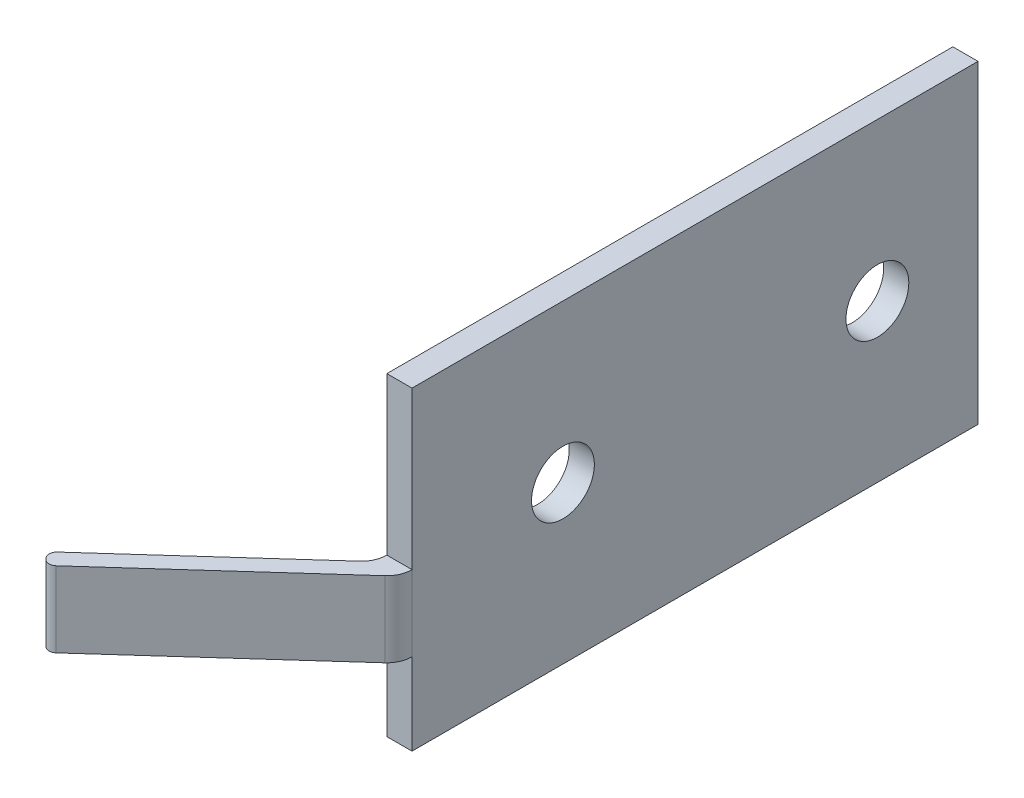
ISO-10303-21;
HEADER;
FILE_DESCRIPTION(('STEP AP214'),'2;1');
FILE_NAME('part.step','',(''),(''),'','','');
FILE_SCHEMA(('AUTOMOTIVE_DESIGN { 1 0 10303 214 1 1 1 1 }'));
ENDSEC;
DATA;
#1=APPLICATION_CONTEXT('core data for automotive mechanical design processes');
#2=APPLICATION_PROTOCOL_DEFINITION('international standard','automotive_design',2000,#1);
#3=PRODUCT_CONTEXT('',#1,'mechanical');
#4=PRODUCT('Part','Part','',(#3));
#5=PRODUCT_RELATED_PRODUCT_CATEGORY('part','',(#4));
#6=PRODUCT_DEFINITION_FORMATION('','',#4);
#7=PRODUCT_DEFINITION_CONTEXT('part definition',#1,'design');
#8=PRODUCT_DEFINITION('design','',#6,#7);
#9=PRODUCT_DEFINITION_SHAPE('','',#8);
#10=(LENGTH_UNIT() NAMED_UNIT(*) SI_UNIT(.MILLI.,.METRE.));
#11=(NAMED_UNIT(*) PLANE_ANGLE_UNIT() SI_UNIT($,.RADIAN.));
#12=(NAMED_UNIT(*) SI_UNIT($,.STERADIAN.) SOLID_ANGLE_UNIT());
#13=UNCERTAINTY_MEASURE_WITH_UNIT(LENGTH_MEASURE(1.E-05),#10,'distance_accuracy_value','');
#14=(GEOMETRIC_REPRESENTATION_CONTEXT(3) GLOBAL_UNCERTAINTY_ASSIGNED_CONTEXT((#13)) GLOBAL_UNIT_ASSIGNED_CONTEXT((#10,
#11,#12)) REPRESENTATION_CONTEXT('',''));
#15=CARTESIAN_POINT('',(0.,0.,0.));
#16=DIRECTION('',(0.,0.,1.));
#17=DIRECTION('',(1.,0.,0.));
#18=AXIS2_PLACEMENT_3D('',#15,#16,#17);
#19=CARTESIAN_POINT('',(-1.,12.5,22.5));
#20=DIRECTION('',(0.,0.,-1.));
#21=DIRECTION('',(-1.,0.,0.));
#22=AXIS2_PLACEMENT_3D('',#19,#20,#21);
#23=PLANE('',#22);
#24=DIRECTION('',(-1.,0.,0.));
#25=VECTOR('',#24,1.);
#26=CARTESIAN_POINT('',(-1.,0.,22.5));
#27=LINE('',#26,#25);
#28=CARTESIAN_POINT('',(1.,0.,22.5));
#29=VERTEX_POINT('',#28);
#30=CARTESIAN_POINT('',(-1.,0.,22.5));
#31=VERTEX_POINT('',#30);
#32=EDGE_CURVE('E206',#29,#31,#27,.T.);
#33=ORIENTED_EDGE('',*,*,#32,.F.);
#34=DIRECTION('',(0.,-1.,0.));
#35=VECTOR('',#34,1.);
#36=CARTESIAN_POINT('',(1.,12.5,22.5));
#37=LINE('',#36,#35);
#38=CARTESIAN_POINT('',(1.,12.5,22.5));
#39=VERTEX_POINT('',#38);
#40=EDGE_CURVE('E291',#39,#29,#37,.T.);
#41=ORIENTED_EDGE('',*,*,#40,.F.);
#42=DIRECTION('',(1.,0.,0.));
#43=VECTOR('',#42,1.);
#44=CARTESIAN_POINT('',(-1.,12.5,22.5));
#45=LINE('',#44,#43);
#46=CARTESIAN_POINT('',(-1.,12.5,22.5));
#47=VERTEX_POINT('',#46);
#48=EDGE_CURVE('E94',#47,#39,#45,.T.);
#49=ORIENTED_EDGE('',*,*,#48,.F.);
#50=DIRECTION('',(0.,-1.,0.));
#51=VECTOR('',#50,1.);
#52=CARTESIAN_POINT('',(-1.,12.5,22.5));
#53=LINE('',#52,#51);
#54=EDGE_CURVE('E11',#47,#31,#53,.T.);
#55=ORIENTED_EDGE('',*,*,#54,.T.);
#56=EDGE_LOOP('',(#33,#41,#49,#55));
#57=FACE_BOUND('',#56,.T.);
#58=ADVANCED_FACE('F39',(#57),#23,.F.);
#59=CARTESIAN_POINT('',(-1.,12.5,-22.5));
#60=DIRECTION('',(1.,0.,0.));
#61=DIRECTION('',(0.,0.,-1.));
#62=AXIS2_PLACEMENT_3D('',#59,#60,#61);
#63=PLANE('',#62);
#64=CARTESIAN_POINT('',(-1.,0.,10.5));
#65=DIRECTION('',(1.,0.,0.));
#66=DIRECTION('',(0.,0.,-1.));
#67=AXIS2_PLACEMENT_3D('',#64,#65,#66);
#68=CIRCLE('',#67,2.5);
#69=CARTESIAN_POINT('',(-1.,0.,8.));
#70=VERTEX_POINT('',#69);
#71=EDGE_CURVE('E211',#70,#70,#68,.T.);
#72=ORIENTED_EDGE('',*,*,#71,.T.);
#73=EDGE_LOOP('',(#72));
#74=FACE_BOUND('',#73,.T.);
#75=CARTESIAN_POINT('',(-1.,0.,-14.5));
#76=DIRECTION('',(1.,0.,0.));
#77=DIRECTION('',(0.,0.,-1.));
#78=AXIS2_PLACEMENT_3D('',#75,#76,#77);
#79=CIRCLE('',#78,2.5);
#80=CARTESIAN_POINT('',(-1.,0.,-17.));
#81=VERTEX_POINT('',#80);
#82=EDGE_CURVE('E297',#81,#81,#79,.T.);
#83=ORIENTED_EDGE('',*,*,#82,.T.);
#84=EDGE_LOOP('',(#83));
#85=FACE_BOUND('',#84,.T.);
#86=DIRECTION('',(0.,0.,1.));
#87=VECTOR('',#86,1.);
#88=CARTESIAN_POINT('',(-1.,-12.5,-22.5));
#89=LINE('',#88,#87);
#90=CARTESIAN_POINT('',(-1.,-12.5,-22.5));
#91=VERTEX_POINT('',#90);
#92=CARTESIAN_POINT('',(-1.,-12.5,22.5));
#93=VERTEX_POINT('',#92);
#94=EDGE_CURVE('E245',#91,#93,#89,.T.);
#95=ORIENTED_EDGE('',*,*,#94,.T.);
#96=CARTESIAN_POINT('',(-1.,-6.,22.5));
#97=VERTEX_POINT('',#96);
#98=EDGE_CURVE('E49',#97,#93,#53,.T.);
#99=ORIENTED_EDGE('',*,*,#98,.F.);
#100=DIRECTION('',(0.,0.,1.));
#101=VECTOR('',#100,1.);
#102=CARTESIAN_POINT('',(-1.,-6.,22.5095426293829));
#103=LINE('',#102,#101);
#104=CARTESIAN_POINT('',(-1.,-6.,22.5095426293829));
#105=VERTEX_POINT('',#104);
#106=EDGE_CURVE('E57',#97,#105,#103,.T.);
#107=ORIENTED_EDGE('',*,*,#106,.T.);
#108=DIRECTION('',(0.,1.,0.));
#109=VECTOR('',#108,1.);
#110=CARTESIAN_POINT('',(-1.,-6.,22.5095426293829));
#111=LINE('',#110,#109);
#112=CARTESIAN_POINT('',(-1.,0.,22.5095426293829));
#113=VERTEX_POINT('',#112);
#114=EDGE_CURVE('E153',#105,#113,#111,.T.);
#115=ORIENTED_EDGE('',*,*,#114,.T.);
#116=DIRECTION('',(0.,0.,1.));
#117=VECTOR('',#116,1.);
#118=CARTESIAN_POINT('',(-1.,0.,22.5095426293829));
#119=LINE('',#118,#117);
#120=EDGE_CURVE('E210',#31,#113,#119,.T.);
#121=ORIENTED_EDGE('',*,*,#120,.F.);
#122=ORIENTED_EDGE('',*,*,#54,.F.);
#123=DIRECTION('',(0.,0.,1.));
#124=VECTOR('',#123,1.);
#125=CARTESIAN_POINT('',(-1.,12.5,-22.5));
#126=LINE('',#125,#124);
#127=CARTESIAN_POINT('',(-1.,12.5,-22.5));
#128=VERTEX_POINT('',#127);
#129=EDGE_CURVE('E263',#128,#47,#126,.T.);
#130=ORIENTED_EDGE('',*,*,#129,.F.);
#131=DIRECTION('',(0.,-1.,0.));
#132=VECTOR('',#131,1.);
#133=CARTESIAN_POINT('',(-1.,12.5,-22.5));
#134=LINE('',#133,#132);
#135=EDGE_CURVE('E273',#128,#91,#134,.T.);
#136=ORIENTED_EDGE('',*,*,#135,.T.);
#137=EDGE_LOOP('',(#95,#99,#107,#115,#121,#122,#130,#136));
#138=FACE_BOUND('',#137,.T.);
#139=ADVANCED_FACE('F41',(#74,#85,#138),#63,.F.);
#140=CARTESIAN_POINT('',(1.,-6.,22.5));
#141=VERTEX_POINT('',#140);
#142=CARTESIAN_POINT('',(1.,-12.5,22.5));
#143=VERTEX_POINT('',#142);
#144=EDGE_CURVE('E290',#141,#143,#37,.T.);
#145=ORIENTED_EDGE('',*,*,#144,.F.);
#146=DIRECTION('',(-1.,0.,0.));
#147=VECTOR('',#146,1.);
#148=CARTESIAN_POINT('',(-1.,-6.,22.5));
#149=LINE('',#148,#147);
#150=EDGE_CURVE('E174',#141,#97,#149,.T.);
#151=ORIENTED_EDGE('',*,*,#150,.T.);
#152=ORIENTED_EDGE('',*,*,#98,.T.);
#153=DIRECTION('',(1.,0.,0.));
#154=VECTOR('',#153,1.);
#155=CARTESIAN_POINT('',(-1.,-12.5,22.5));
#156=LINE('',#155,#154);
#157=EDGE_CURVE('E276',#93,#143,#156,.T.);
#158=ORIENTED_EDGE('',*,*,#157,.T.);
#159=EDGE_LOOP('',(#145,#151,#152,#158));
#160=FACE_BOUND('',#159,.T.);
#161=ADVANCED_FACE('F325',(#160),#23,.F.);
#162=CARTESIAN_POINT('',(1.,12.5,-22.5));
#163=DIRECTION('',(-1.,0.,0.));
#164=DIRECTION('',(0.,0.,1.));
#165=AXIS2_PLACEMENT_3D('',#162,#163,#164);
#166=PLANE('',#165);
#167=CARTESIAN_POINT('',(1.,0.,10.5));
#168=DIRECTION('',(-1.,0.,0.));
#169=DIRECTION('',(0.,0.,1.));
#170=AXIS2_PLACEMENT_3D('',#167,#168,#169);
#171=CIRCLE('',#170,2.5);
#172=CARTESIAN_POINT('',(1.,0.,8.));
#173=VERTEX_POINT('',#172);
#174=EDGE_CURVE('E43',#173,#173,#171,.T.);
#175=ORIENTED_EDGE('',*,*,#174,.T.);
#176=EDGE_LOOP('',(#175));
#177=FACE_BOUND('',#176,.T.);
#178=CARTESIAN_POINT('',(1.,0.,-14.5));
#179=DIRECTION('',(-1.,0.,0.));
#180=DIRECTION('',(0.,0.,1.));
#181=AXIS2_PLACEMENT_3D('',#178,#179,#180);
#182=CIRCLE('',#181,2.5);
#183=CARTESIAN_POINT('',(1.,0.,-17.));
#184=VERTEX_POINT('',#183);
#185=EDGE_CURVE('E294',#184,#184,#182,.T.);
#186=ORIENTED_EDGE('',*,*,#185,.T.);
#187=EDGE_LOOP('',(#186));
#188=FACE_BOUND('',#187,.T.);
#189=DIRECTION('',(0.,0.,-1.));
#190=VECTOR('',#189,1.);
#191=CARTESIAN_POINT('',(1.,-12.5,-22.5));
#192=LINE('',#191,#190);
#193=CARTESIAN_POINT('',(1.,-12.5,-22.5));
#194=VERTEX_POINT('',#193);
#195=EDGE_CURVE('E280',#143,#194,#192,.T.);
#196=ORIENTED_EDGE('',*,*,#195,.T.);
#197=DIRECTION('',(0.,-1.,0.));
#198=VECTOR('',#197,1.);
#199=CARTESIAN_POINT('',(1.,12.5,-22.5));
#200=LINE('',#199,#198);
#201=CARTESIAN_POINT('',(1.,12.5,-22.5));
#202=VERTEX_POINT('',#201);
#203=EDGE_CURVE('E287',#202,#194,#200,.T.);
#204=ORIENTED_EDGE('',*,*,#203,.F.);
#205=DIRECTION('',(0.,0.,-1.));
#206=VECTOR('',#205,1.);
#207=CARTESIAN_POINT('',(1.,12.5,-22.5));
#208=LINE('',#207,#206);
#209=EDGE_CURVE('E268',#39,#202,#208,.T.);
#210=ORIENTED_EDGE('',*,*,#209,.F.);
#211=ORIENTED_EDGE('',*,*,#40,.T.);
#212=DIRECTION('',(0.,0.,-1.));
#213=VECTOR('',#212,1.);
#214=CARTESIAN_POINT('',(1.,0.,22.5));
#215=LINE('',#214,#213);
#216=CARTESIAN_POINT('',(1.,0.,22.5095426293829));
#217=VERTEX_POINT('',#216);
#218=EDGE_CURVE('E177',#217,#29,#215,.T.);
#219=ORIENTED_EDGE('',*,*,#218,.F.);
#220=DIRECTION('',(0.,1.,0.));
#221=VECTOR('',#220,1.);
#222=CARTESIAN_POINT('',(1.,-6.,22.5095426293829));
#223=LINE('',#222,#221);
#224=CARTESIAN_POINT('',(1.,-6.,22.5095426293829));
#225=VERTEX_POINT('',#224);
#226=EDGE_CURVE('E242',#225,#217,#223,.T.);
#227=ORIENTED_EDGE('',*,*,#226,.F.);
#228=DIRECTION('',(0.,0.,-1.));
#229=VECTOR('',#228,1.);
#230=CARTESIAN_POINT('',(1.,-6.,22.5));
#231=LINE('',#230,#229);
#232=EDGE_CURVE('E162',#225,#141,#231,.T.);
#233=ORIENTED_EDGE('',*,*,#232,.T.);
#234=ORIENTED_EDGE('',*,*,#144,.T.);
#235=EDGE_LOOP('',(#196,#204,#210,#211,#219,#227,#233,#234));
#236=FACE_BOUND('',#235,.T.);
#237=ADVANCED_FACE('F332',(#177,#188,#236),#166,.F.);
#238=CARTESIAN_POINT('',(-1.,12.5,-22.5));
#239=DIRECTION('',(0.,0.,1.));
#240=DIRECTION('',(1.,0.,0.));
#241=AXIS2_PLACEMENT_3D('',#238,#239,#240);
#242=PLANE('',#241);
#243=DIRECTION('',(-1.,0.,0.));
#244=VECTOR('',#243,1.);
#245=CARTESIAN_POINT('',(-1.,-12.5,-22.5));
#246=LINE('',#245,#244);
#247=EDGE_CURVE('E87',#194,#91,#246,.T.);
#248=ORIENTED_EDGE('',*,*,#247,.T.);
#249=ORIENTED_EDGE('',*,*,#135,.F.);
#250=DIRECTION('',(-1.,0.,0.));
#251=VECTOR('',#250,1.);
#252=CARTESIAN_POINT('',(-1.,12.5,-22.5));
#253=LINE('',#252,#251);
#254=EDGE_CURVE('E66',#202,#128,#253,.T.);
#255=ORIENTED_EDGE('',*,*,#254,.F.);
#256=ORIENTED_EDGE('',*,*,#203,.T.);
#257=EDGE_LOOP('',(#248,#249,#255,#256));
#258=FACE_BOUND('',#257,.T.);
#259=ADVANCED_FACE('F337',(#258),#242,.F.);
#260=CARTESIAN_POINT('',(0.,12.5,0.));
#261=DIRECTION('',(0.,1.,0.));
#262=DIRECTION('',(0.,0.,1.));
#263=AXIS2_PLACEMENT_3D('',#260,#261,#262);
#264=PLANE('',#263);
#265=ORIENTED_EDGE('',*,*,#129,.T.);
#266=ORIENTED_EDGE('',*,*,#48,.T.);
#267=ORIENTED_EDGE('',*,*,#209,.T.);
#268=ORIENTED_EDGE('',*,*,#254,.T.);
#269=EDGE_LOOP('',(#265,#266,#267,#268));
#270=FACE_BOUND('',#269,.T.);
#271=ADVANCED_FACE('F353',(#270),#264,.T.);
#272=CARTESIAN_POINT('',(0.,-12.5,0.));
#273=DIRECTION('',(0.,1.,0.));
#274=DIRECTION('',(0.,0.,1.));
#275=AXIS2_PLACEMENT_3D('',#272,#273,#274);
#276=PLANE('',#275);
#277=ORIENTED_EDGE('',*,*,#94,.F.);
#278=ORIENTED_EDGE('',*,*,#247,.F.);
#279=ORIENTED_EDGE('',*,*,#195,.F.);
#280=ORIENTED_EDGE('',*,*,#157,.F.);
#281=EDGE_LOOP('',(#277,#278,#279,#280));
#282=FACE_BOUND('',#281,.T.);
#283=ADVANCED_FACE('F347',(#282),#276,.F.);
#284=CARTESIAN_POINT('',(-1.,-6.,22.5095426293829));
#285=DIRECTION('',(0.,1.,0.));
#286=DIRECTION('',(0.,0.,1.));
#287=AXIS2_PLACEMENT_3D('',#284,#285,#286);
#288=CYLINDRICAL_SURFACE('',#287,2.);
#289=CARTESIAN_POINT('',(-1.,0.,22.5095426293829));
#290=DIRECTION('',(0.,1.,0.));
#291=DIRECTION('',(0.,0.,-1.));
#292=AXIS2_PLACEMENT_3D('',#289,#290,#291);
#293=CIRCLE('',#292,2.);
#294=CARTESIAN_POINT('',(0.338261212717725,0.,23.9958322803377));
#295=VERTEX_POINT('',#294);
#296=EDGE_CURVE('E236',#295,#217,#293,.T.);
#297=ORIENTED_EDGE('',*,*,#296,.F.);
#298=DIRECTION('',(0.,1.,0.));
#299=VECTOR('',#298,1.);
#300=CARTESIAN_POINT('',(0.338261212717725,-6.,23.9958322803377));
#301=LINE('',#300,#299);
#302=CARTESIAN_POINT('',(0.338261212717725,-6.,23.9958322803377));
#303=VERTEX_POINT('',#302);
#304=EDGE_CURVE('E246',#303,#295,#301,.T.);
#305=ORIENTED_EDGE('',*,*,#304,.F.);
#306=CARTESIAN_POINT('',(-1.,-6.,22.5095426293829));
#307=DIRECTION('',(0.,1.,0.));
#308=DIRECTION('',(0.,0.,-1.));
#309=AXIS2_PLACEMENT_3D('',#306,#307,#308);
#310=CIRCLE('',#309,2.);
#311=EDGE_CURVE('E199',#303,#225,#310,.T.);
#312=ORIENTED_EDGE('',*,*,#311,.T.);
#313=ORIENTED_EDGE('',*,*,#226,.T.);
#314=EDGE_LOOP('',(#297,#305,#312,#313));
#315=FACE_BOUND('',#314,.T.);
#316=ADVANCED_FACE('F359',(#315),#288,.T.);
#317=CARTESIAN_POINT('',(0.338261212717725,-6.,23.9958322803377));
#318=DIRECTION('',(0.669130606358861,0.,0.743144825477392));
#319=DIRECTION('',(0.743144825477392,0.,-0.669130606358861));
#320=AXIS2_PLACEMENT_3D('',#317,#318,#319);
#321=PLANE('',#320);
#322=DIRECTION('',(0.743144825477392,0.,-0.669130606358861));
#323=VECTOR('',#322,1.);
#324=CARTESIAN_POINT('',(0.338261212717725,0.,23.9958322803377));
#325=LINE('',#324,#323);
#326=CARTESIAN_POINT('',(-13.4170096142614,0.,36.3811337633619));
#327=VERTEX_POINT('',#326);
#328=EDGE_CURVE('E232',#327,#295,#325,.T.);
#329=ORIENTED_EDGE('',*,*,#328,.F.);
#330=DIRECTION('',(0.,1.,0.));
#331=VECTOR('',#330,1.);
#332=CARTESIAN_POINT('',(-13.4170096142614,-6.,36.3811337633619));
#333=LINE('',#332,#331);
#334=CARTESIAN_POINT('',(-13.4170096142614,-6.,36.3811337633619));
#335=VERTEX_POINT('',#334);
#336=EDGE_CURVE('E249',#335,#327,#333,.T.);
#337=ORIENTED_EDGE('',*,*,#336,.F.);
#338=DIRECTION('',(0.743144825477392,0.,-0.669130606358861));
#339=VECTOR('',#338,1.);
#340=CARTESIAN_POINT('',(0.338261212717725,-6.,23.9958322803377));
#341=LINE('',#340,#339);
#342=EDGE_CURVE('E195',#335,#303,#341,.T.);
#343=ORIENTED_EDGE('',*,*,#342,.T.);
#344=ORIENTED_EDGE('',*,*,#304,.T.);
#345=EDGE_LOOP('',(#329,#337,#343,#344));
#346=FACE_BOUND('',#345,.T.);
#347=ADVANCED_FACE('F364',(#346),#321,.T.);
#348=CARTESIAN_POINT('',(-13.8184879780767,-6.,35.9352468680755));
#349=DIRECTION('',(0.,1.,0.));
#350=DIRECTION('',(0.,0.,1.));
#351=AXIS2_PLACEMENT_3D('',#348,#349,#350);
#352=CYLINDRICAL_SURFACE('',#351,0.600000000000002);
#353=CARTESIAN_POINT('',(-13.8184879780767,0.,35.9352468680755));
#354=DIRECTION('',(0.,1.,0.));
#355=DIRECTION('',(0.,0.,-1.));
#356=AXIS2_PLACEMENT_3D('',#353,#354,#355);
#357=CIRCLE('',#356,0.600000000000002);
#358=CARTESIAN_POINT('',(-14.2643748733632,0.,36.3367252318908));
#359=VERTEX_POINT('',#358);
#360=EDGE_CURVE('E228',#359,#327,#357,.T.);
#361=ORIENTED_EDGE('',*,*,#360,.F.);
#362=DIRECTION('',(0.,1.,0.));
#363=VECTOR('',#362,1.);
#364=CARTESIAN_POINT('',(-14.2643748733632,-6.,36.3367252318908));
#365=LINE('',#364,#363);
#366=CARTESIAN_POINT('',(-14.2643748733632,-6.,36.3367252318908));
#367=VERTEX_POINT('',#366);
#368=EDGE_CURVE('E252',#367,#359,#365,.T.);
#369=ORIENTED_EDGE('',*,*,#368,.F.);
#370=CARTESIAN_POINT('',(-13.8184879780767,-6.,35.9352468680755));
#371=DIRECTION('',(0.,1.,0.));
#372=DIRECTION('',(0.,0.,-1.));
#373=AXIS2_PLACEMENT_3D('',#370,#371,#372);
#374=CIRCLE('',#373,0.600000000000002);
#375=EDGE_CURVE('E191',#367,#335,#374,.T.);
#376=ORIENTED_EDGE('',*,*,#375,.T.);
#377=ORIENTED_EDGE('',*,*,#336,.T.);
#378=EDGE_LOOP('',(#361,#369,#376,#377));
#379=FACE_BOUND('',#378,.T.);
#380=ADVANCED_FACE('F367',(#379),#352,.T.);
#381=CARTESIAN_POINT('',(-14.2643748733632,-6.,36.3367252318908));
#382=DIRECTION('',(-0.74314482547739,0.,0.669130606358863));
#383=DIRECTION('',(0.669130606358863,0.,0.74314482547739));
#384=AXIS2_PLACEMENT_3D('',#381,#382,#383);
#385=PLANE('',#384);
#386=DIRECTION('',(0.669130606358863,0.,0.74314482547739));
#387=VECTOR('',#386,1.);
#388=CARTESIAN_POINT('',(-14.2643748733632,0.,36.3367252318908));
#389=LINE('',#388,#387);
#390=CARTESIAN_POINT('',(-14.3568896824649,0.,36.2339771270954));
#391=VERTEX_POINT('',#390);
#392=EDGE_CURVE('E224',#391,#359,#389,.T.);
#393=ORIENTED_EDGE('',*,*,#392,.F.);
#394=DIRECTION('',(0.,1.,0.));
#395=VECTOR('',#394,1.);
#396=CARTESIAN_POINT('',(-14.3568896824649,-6.,36.2339771270954));
#397=LINE('',#396,#395);
#398=CARTESIAN_POINT('',(-14.3568896824649,-6.,36.2339771270954));
#399=VERTEX_POINT('',#398);
#400=EDGE_CURVE('E255',#399,#391,#397,.T.);
#401=ORIENTED_EDGE('',*,*,#400,.F.);
#402=DIRECTION('',(0.669130606358863,0.,0.74314482547739));
#403=VECTOR('',#402,1.);
#404=CARTESIAN_POINT('',(-14.2643748733632,-6.,36.3367252318908));
#405=LINE('',#404,#403);
#406=EDGE_CURVE('E187',#399,#367,#405,.T.);
#407=ORIENTED_EDGE('',*,*,#406,.T.);
#408=ORIENTED_EDGE('',*,*,#368,.T.);
#409=EDGE_LOOP('',(#393,#401,#407,#408));
#410=FACE_BOUND('',#409,.T.);
#411=ADVANCED_FACE('F371',(#410),#385,.T.);
#412=CARTESIAN_POINT('',(-13.9110027871784,-6.,35.8324987632801));
#413=DIRECTION('',(0.,1.,0.));
#414=DIRECTION('',(0.,0.,1.));
#415=AXIS2_PLACEMENT_3D('',#412,#413,#414);
#416=CYLINDRICAL_SURFACE('',#415,0.6);
#417=CARTESIAN_POINT('',(-13.9110027871784,0.,35.8324987632801));
#418=DIRECTION('',(0.,1.,0.));
#419=DIRECTION('',(0.,0.,-1.));
#420=AXIS2_PLACEMENT_3D('',#417,#418,#419);
#421=CIRCLE('',#420,0.6);
#422=CARTESIAN_POINT('',(-14.3124811509938,0.,35.3866118679936));
#423=VERTEX_POINT('',#422);
#424=EDGE_CURVE('E220',#423,#391,#421,.T.);
#425=ORIENTED_EDGE('',*,*,#424,.F.);
#426=DIRECTION('',(0.,1.,0.));
#427=VECTOR('',#426,1.);
#428=CARTESIAN_POINT('',(-14.3124811509938,-6.,35.3866118679936));
#429=LINE('',#428,#427);
#430=CARTESIAN_POINT('',(-14.3124811509938,-6.,35.3866118679936));
#431=VERTEX_POINT('',#430);
#432=EDGE_CURVE('E258',#431,#423,#429,.T.);
#433=ORIENTED_EDGE('',*,*,#432,.F.);
#434=CARTESIAN_POINT('',(-13.9110027871784,-6.,35.8324987632801));
#435=DIRECTION('',(0.,1.,0.));
#436=DIRECTION('',(0.,0.,-1.));
#437=AXIS2_PLACEMENT_3D('',#434,#435,#436);
#438=CIRCLE('',#437,0.6);
#439=EDGE_CURVE('E183',#431,#399,#438,.T.);
#440=ORIENTED_EDGE('',*,*,#439,.T.);
#441=ORIENTED_EDGE('',*,*,#400,.T.);
#442=EDGE_LOOP('',(#425,#433,#440,#441));
#443=FACE_BOUND('',#442,.T.);
#444=ADVANCED_FACE('F374',(#443),#416,.T.);
#445=CARTESIAN_POINT('',(-14.3124811509938,-6.,35.3866118679936));
#446=DIRECTION('',(-0.669130606358861,0.,-0.743144825477392));
#447=DIRECTION('',(-0.743144825477392,0.,0.669130606358861));
#448=AXIS2_PLACEMENT_3D('',#445,#446,#447);
#449=PLANE('',#448);
#450=DIRECTION('',(-0.743144825477392,0.,0.669130606358861));
#451=VECTOR('',#450,1.);
#452=CARTESIAN_POINT('',(-14.3124811509938,0.,35.3866118679936));
#453=LINE('',#452,#451);
#454=CARTESIAN_POINT('',(-1.66173878728228,0.,23.9958322803377));
#455=VERTEX_POINT('',#454);
#456=EDGE_CURVE('E216',#455,#423,#453,.T.);
#457=ORIENTED_EDGE('',*,*,#456,.F.);
#458=DIRECTION('',(0.,1.,0.));
#459=VECTOR('',#458,1.);
#460=CARTESIAN_POINT('',(-1.66173878728228,-6.,23.9958322803377));
#461=LINE('',#460,#459);
#462=CARTESIAN_POINT('',(-1.66173878728228,-6.,23.9958322803377));
#463=VERTEX_POINT('',#462);
#464=EDGE_CURVE('E161',#463,#455,#461,.T.);
#465=ORIENTED_EDGE('',*,*,#464,.F.);
#466=DIRECTION('',(-0.743144825477392,0.,0.669130606358861));
#467=VECTOR('',#466,1.);
#468=CARTESIAN_POINT('',(-14.3124811509938,-6.,35.3866118679936));
#469=LINE('',#468,#467);
#470=EDGE_CURVE('E168',#463,#431,#469,.T.);
#471=ORIENTED_EDGE('',*,*,#470,.T.);
#472=ORIENTED_EDGE('',*,*,#432,.T.);
#473=EDGE_LOOP('',(#457,#465,#471,#472));
#474=FACE_BOUND('',#473,.T.);
#475=ADVANCED_FACE('F377',(#474),#449,.T.);
#476=CARTESIAN_POINT('',(-3.,-6.,22.5095426293829));
#477=DIRECTION('',(0.,1.,0.));
#478=DIRECTION('',(0.,0.,1.));
#479=AXIS2_PLACEMENT_3D('',#476,#477,#478);
#480=CYLINDRICAL_SURFACE('',#479,2.);
#481=CARTESIAN_POINT('',(-3.,0.,22.5095426293829));
#482=DIRECTION('',(0.,-1.,0.));
#483=DIRECTION('',(0.,0.,1.));
#484=AXIS2_PLACEMENT_3D('',#481,#482,#483);
#485=CIRCLE('',#484,2.);
#486=EDGE_CURVE('E157',#113,#455,#485,.T.);
#487=ORIENTED_EDGE('',*,*,#486,.F.);
#488=ORIENTED_EDGE('',*,*,#114,.F.);
#489=CARTESIAN_POINT('',(-3.,-6.,22.5095426293829));
#490=DIRECTION('',(0.,-1.,0.));
#491=DIRECTION('',(0.,0.,1.));
#492=AXIS2_PLACEMENT_3D('',#489,#490,#491);
#493=CIRCLE('',#492,2.);
#494=EDGE_CURVE('E155',#105,#463,#493,.T.);
#495=ORIENTED_EDGE('',*,*,#494,.T.);
#496=ORIENTED_EDGE('',*,*,#464,.T.);
#497=EDGE_LOOP('',(#487,#488,#495,#496));
#498=FACE_BOUND('',#497,.T.);
#499=ADVANCED_FACE('F154',(#498),#480,.F.);
#500=CARTESIAN_POINT('',(-1.,-6.,22.5095426293829));
#501=DIRECTION('',(0.,-1.,0.));
#502=DIRECTION('',(0.,0.,-1.));
#503=AXIS2_PLACEMENT_3D('',#500,#501,#502);
#504=PLANE('',#503);
#505=ORIENTED_EDGE('',*,*,#150,.F.);
#506=ORIENTED_EDGE('',*,*,#232,.F.);
#507=ORIENTED_EDGE('',*,*,#311,.F.);
#508=ORIENTED_EDGE('',*,*,#342,.F.);
#509=ORIENTED_EDGE('',*,*,#375,.F.);
#510=ORIENTED_EDGE('',*,*,#406,.F.);
#511=ORIENTED_EDGE('',*,*,#439,.F.);
#512=ORIENTED_EDGE('',*,*,#470,.F.);
#513=ORIENTED_EDGE('',*,*,#494,.F.);
#514=ORIENTED_EDGE('',*,*,#106,.F.);
#515=EDGE_LOOP('',(#505,#506,#507,#508,#509,#510,#511,#512,#513,#514));
#516=FACE_BOUND('',#515,.T.);
#517=ADVANCED_FACE('F165',(#516),#504,.T.);
#518=CARTESIAN_POINT('',(-1.,0.,22.5095426293829));
#519=DIRECTION('',(0.,-1.,0.));
#520=DIRECTION('',(0.,0.,-1.));
#521=AXIS2_PLACEMENT_3D('',#518,#519,#520);
#522=PLANE('',#521);
#523=ORIENTED_EDGE('',*,*,#32,.T.);
#524=ORIENTED_EDGE('',*,*,#120,.T.);
#525=ORIENTED_EDGE('',*,*,#486,.T.);
#526=ORIENTED_EDGE('',*,*,#456,.T.);
#527=ORIENTED_EDGE('',*,*,#424,.T.);
#528=ORIENTED_EDGE('',*,*,#392,.T.);
#529=ORIENTED_EDGE('',*,*,#360,.T.);
#530=ORIENTED_EDGE('',*,*,#328,.T.);
#531=ORIENTED_EDGE('',*,*,#296,.T.);
#532=ORIENTED_EDGE('',*,*,#218,.T.);
#533=EDGE_LOOP('',(#523,#524,#525,#526,#527,#528,#529,#530,#531,#532));
#534=FACE_BOUND('',#533,.T.);
#535=ADVANCED_FACE('F320',(#534),#522,.F.);
#536=CARTESIAN_POINT('',(-2.,0.,-14.5));
#537=DIRECTION('',(1.,0.,0.));
#538=DIRECTION('',(0.,0.,-1.));
#539=AXIS2_PLACEMENT_3D('',#536,#537,#538);
#540=CYLINDRICAL_SURFACE('',#539,2.5);
#541=CARTESIAN_POINT('',(1.,0.,-17.));
#542=CARTESIAN_POINT('',(0.979166666666667,0.,-17.));
#543=CARTESIAN_POINT('',(0.958333333333333,0.,-17.));
#544=CARTESIAN_POINT('',(0.916666666666667,0.,-17.));
#545=CARTESIAN_POINT('',(0.895833333333333,0.,-17.));
#546=CARTESIAN_POINT('',(0.854166666666667,0.,-17.));
#547=CARTESIAN_POINT('',(0.833333333333333,0.,-17.));
#548=CARTESIAN_POINT('',(0.791666666666667,0.,-17.));
#549=CARTESIAN_POINT('',(0.770833333333333,0.,-17.));
#550=CARTESIAN_POINT('',(0.729166666666667,0.,-17.));
#551=CARTESIAN_POINT('',(0.708333333333333,0.,-17.));
#552=CARTESIAN_POINT('',(0.666666666666667,0.,-17.));
#553=CARTESIAN_POINT('',(0.645833333333333,0.,-17.));
#554=CARTESIAN_POINT('',(0.604166666666667,0.,-17.));
#555=CARTESIAN_POINT('',(0.583333333333333,0.,-17.));
#556=CARTESIAN_POINT('',(0.541666666666667,0.,-17.));
#557=CARTESIAN_POINT('',(0.520833333333333,0.,-17.));
#558=CARTESIAN_POINT('',(0.479166666666667,0.,-17.));
#559=CARTESIAN_POINT('',(0.458333333333333,0.,-17.));
#560=CARTESIAN_POINT('',(0.416666666666667,0.,-17.));
#561=CARTESIAN_POINT('',(0.395833333333333,0.,-17.));
#562=CARTESIAN_POINT('',(0.354166666666667,0.,-17.));
#563=CARTESIAN_POINT('',(0.333333333333333,0.,-17.));
#564=CARTESIAN_POINT('',(0.291666666666667,0.,-17.));
#565=CARTESIAN_POINT('',(0.270833333333334,0.,-17.));
#566=CARTESIAN_POINT('',(0.229166666666667,0.,-17.));
#567=CARTESIAN_POINT('',(0.208333333333334,0.,-17.));
#568=CARTESIAN_POINT('',(0.166666666666667,0.,-17.));
#569=CARTESIAN_POINT('',(0.145833333333333,0.,-17.));
#570=CARTESIAN_POINT('',(0.104166666666667,0.,-17.));
#571=CARTESIAN_POINT('',(0.0833333333333334,0.,-17.));
#572=CARTESIAN_POINT('',(0.0416666666666667,0.,-17.));
#573=CARTESIAN_POINT('',(0.0208333333333334,0.,-17.));
#574=CARTESIAN_POINT('',(-0.0208333333333334,0.,-17.));
#575=CARTESIAN_POINT('',(-0.0416666666666667,0.,-17.));
#576=CARTESIAN_POINT('',(-0.0833333333333334,0.,-17.));
#577=CARTESIAN_POINT('',(-0.104166666666667,0.,-17.));
#578=CARTESIAN_POINT('',(-0.145833333333333,0.,-17.));
#579=CARTESIAN_POINT('',(-0.166666666666667,0.,-17.));
#580=CARTESIAN_POINT('',(-0.208333333333333,0.,-17.));
#581=CARTESIAN_POINT('',(-0.229166666666667,0.,-17.));
#582=CARTESIAN_POINT('',(-0.270833333333333,0.,-17.));
#583=CARTESIAN_POINT('',(-0.291666666666667,0.,-17.));
#584=CARTESIAN_POINT('',(-0.333333333333333,0.,-17.));
#585=CARTESIAN_POINT('',(-0.354166666666667,0.,-17.));
#586=CARTESIAN_POINT('',(-0.395833333333333,0.,-17.));
#587=CARTESIAN_POINT('',(-0.416666666666667,0.,-17.));
#588=CARTESIAN_POINT('',(-0.458333333333333,0.,-17.));
#589=CARTESIAN_POINT('',(-0.479166666666667,0.,-17.));
#590=CARTESIAN_POINT('',(-0.520833333333333,0.,-17.));
#591=CARTESIAN_POINT('',(-0.541666666666667,0.,-17.));
#592=CARTESIAN_POINT('',(-0.583333333333333,0.,-17.));
#593=CARTESIAN_POINT('',(-0.604166666666667,0.,-17.));
#594=CARTESIAN_POINT('',(-0.645833333333333,0.,-17.));
#595=CARTESIAN_POINT('',(-0.666666666666667,0.,-17.));
#596=CARTESIAN_POINT('',(-0.708333333333333,0.,-17.));
#597=CARTESIAN_POINT('',(-0.729166666666667,0.,-17.));
#598=CARTESIAN_POINT('',(-0.770833333333333,0.,-17.));
#599=CARTESIAN_POINT('',(-0.791666666666667,0.,-17.));
#600=CARTESIAN_POINT('',(-0.833333333333333,0.,-17.));
#601=CARTESIAN_POINT('',(-0.854166666666667,0.,-17.));
#602=CARTESIAN_POINT('',(-0.895833333333333,0.,-17.));
#603=CARTESIAN_POINT('',(-0.916666666666667,0.,-17.));
#604=CARTESIAN_POINT('',(-0.958333333333333,0.,-17.));
#605=CARTESIAN_POINT('',(-0.979166666666667,0.,-17.));
#606=CARTESIAN_POINT('',(-1.,0.,-17.));
#607=B_SPLINE_CURVE_WITH_KNOTS('',3,(#541,#542,#543,#544,#545,#546,#547,#548,#549,#550,#551,
#552,#553,#554,#555,#556,#557,#558,#559,#560,#561,#562,#563,#564,#565,#566,#567,#568,#569,#570,
#571,#572,#573,#574,#575,#576,#577,#578,#579,#580,#581,#582,#583,#584,#585,#586,#587,#588,#589,
#590,#591,#592,#593,#594,#595,#596,#597,#598,#599,#600,#601,#602,#603,#604,#605,#606),
.UNSPECIFIED.,.F.,.F.,(4,2,2,2,2,2,2,2,2,2,2,2,2,2,2,2,2,2,2,2,2,2,2,2,2,2,2,2,2,2,2,2,4),(0.,
0.0625000000000001,0.125,0.1875,0.25,0.3125,0.375,0.4375,0.5,0.5625,0.625,0.6875,0.75,0.8125,
0.875,0.9375,1.,1.0625,1.125,1.1875,1.25,1.3125,1.375,1.4375,1.5,1.5625,1.625,1.6875,1.75,
1.8125,1.875,1.9375,2.),.UNSPECIFIED.);
#608=EDGE_CURVE('BSEAM314',#184,#81,#607,.T.);
#609=ORIENTED_EDGE('',*,*,#185,.F.);
#610=ORIENTED_EDGE('',*,*,#82,.F.);
#611=ORIENTED_EDGE('',*,*,#608,.T.);
#612=ORIENTED_EDGE('',*,*,#608,.F.);
#613=EDGE_LOOP('',(#609,#611,#610,#612));
#614=FACE_BOUND('',#613,.T.);
#615=ADVANCED_FACE('F314',(#614),#540,.F.);
#616=CARTESIAN_POINT('',(-2.,0.,10.5));
#617=DIRECTION('',(1.,0.,0.));
#618=DIRECTION('',(0.,0.,-1.));
#619=AXIS2_PLACEMENT_3D('',#616,#617,#618);
#620=CYLINDRICAL_SURFACE('',#619,2.5);
#621=CARTESIAN_POINT('',(1.,0.,8.));
#622=CARTESIAN_POINT('',(0.979166666666667,0.,8.));
#623=CARTESIAN_POINT('',(0.958333333333333,0.,8.));
#624=CARTESIAN_POINT('',(0.916666666666667,0.,8.));
#625=CARTESIAN_POINT('',(0.895833333333333,0.,8.));
#626=CARTESIAN_POINT('',(0.854166666666667,0.,8.));
#627=CARTESIAN_POINT('',(0.833333333333333,0.,8.));
#628=CARTESIAN_POINT('',(0.791666666666667,0.,8.));
#629=CARTESIAN_POINT('',(0.770833333333333,0.,8.));
#630=CARTESIAN_POINT('',(0.729166666666667,0.,8.));
#631=CARTESIAN_POINT('',(0.708333333333333,0.,8.));
#632=CARTESIAN_POINT('',(0.666666666666667,0.,8.));
#633=CARTESIAN_POINT('',(0.645833333333333,0.,8.));
#634=CARTESIAN_POINT('',(0.604166666666667,0.,8.));
#635=CARTESIAN_POINT('',(0.583333333333333,0.,8.));
#636=CARTESIAN_POINT('',(0.541666666666667,0.,8.));
#637=CARTESIAN_POINT('',(0.520833333333333,0.,8.));
#638=CARTESIAN_POINT('',(0.479166666666667,0.,8.));
#639=CARTESIAN_POINT('',(0.458333333333333,0.,8.));
#640=CARTESIAN_POINT('',(0.416666666666667,0.,8.));
#641=CARTESIAN_POINT('',(0.395833333333333,0.,8.));
#642=CARTESIAN_POINT('',(0.354166666666667,0.,8.));
#643=CARTESIAN_POINT('',(0.333333333333333,0.,8.));
#644=CARTESIAN_POINT('',(0.291666666666667,0.,8.));
#645=CARTESIAN_POINT('',(0.270833333333334,0.,8.));
#646=CARTESIAN_POINT('',(0.229166666666667,0.,8.));
#647=CARTESIAN_POINT('',(0.208333333333334,0.,8.));
#648=CARTESIAN_POINT('',(0.166666666666667,0.,8.));
#649=CARTESIAN_POINT('',(0.145833333333333,0.,8.));
#650=CARTESIAN_POINT('',(0.104166666666667,0.,8.));
#651=CARTESIAN_POINT('',(0.0833333333333334,0.,8.));
#652=CARTESIAN_POINT('',(0.0416666666666667,0.,8.));
#653=CARTESIAN_POINT('',(0.0208333333333334,0.,8.));
#654=CARTESIAN_POINT('',(-0.0208333333333334,0.,8.));
#655=CARTESIAN_POINT('',(-0.0416666666666667,0.,8.));
#656=CARTESIAN_POINT('',(-0.0833333333333334,0.,8.));
#657=CARTESIAN_POINT('',(-0.104166666666667,0.,8.));
#658=CARTESIAN_POINT('',(-0.145833333333333,0.,8.));
#659=CARTESIAN_POINT('',(-0.166666666666667,0.,8.));
#660=CARTESIAN_POINT('',(-0.208333333333333,0.,8.));
#661=CARTESIAN_POINT('',(-0.229166666666667,0.,8.));
#662=CARTESIAN_POINT('',(-0.270833333333333,0.,8.));
#663=CARTESIAN_POINT('',(-0.291666666666667,0.,8.));
#664=CARTESIAN_POINT('',(-0.333333333333333,0.,8.));
#665=CARTESIAN_POINT('',(-0.354166666666667,0.,8.));
#666=CARTESIAN_POINT('',(-0.395833333333333,0.,8.));
#667=CARTESIAN_POINT('',(-0.416666666666667,0.,8.));
#668=CARTESIAN_POINT('',(-0.458333333333333,0.,8.));
#669=CARTESIAN_POINT('',(-0.479166666666667,0.,8.));
#670=CARTESIAN_POINT('',(-0.520833333333333,0.,8.));
#671=CARTESIAN_POINT('',(-0.541666666666667,0.,8.));
#672=CARTESIAN_POINT('',(-0.583333333333333,0.,8.));
#673=CARTESIAN_POINT('',(-0.604166666666667,0.,8.));
#674=CARTESIAN_POINT('',(-0.645833333333333,0.,8.));
#675=CARTESIAN_POINT('',(-0.666666666666667,0.,8.));
#676=CARTESIAN_POINT('',(-0.708333333333333,0.,8.));
#677=CARTESIAN_POINT('',(-0.729166666666667,0.,8.));
#678=CARTESIAN_POINT('',(-0.770833333333333,0.,8.));
#679=CARTESIAN_POINT('',(-0.791666666666667,0.,8.));
#680=CARTESIAN_POINT('',(-0.833333333333333,0.,8.));
#681=CARTESIAN_POINT('',(-0.854166666666667,0.,8.));
#682=CARTESIAN_POINT('',(-0.895833333333333,0.,8.));
#683=CARTESIAN_POINT('',(-0.916666666666667,0.,8.));
#684=CARTESIAN_POINT('',(-0.958333333333333,0.,8.));
#685=CARTESIAN_POINT('',(-0.979166666666667,0.,8.));
#686=CARTESIAN_POINT('',(-1.,0.,8.));
#687=B_SPLINE_CURVE_WITH_KNOTS('',3,(#621,#622,#623,#624,#625,#626,#627,#628,#629,#630,#631,
#632,#633,#634,#635,#636,#637,#638,#639,#640,#641,#642,#643,#644,#645,#646,#647,#648,#649,#650,
#651,#652,#653,#654,#655,#656,#657,#658,#659,#660,#661,#662,#663,#664,#665,#666,#667,#668,#669,
#670,#671,#672,#673,#674,#675,#676,#677,#678,#679,#680,#681,#682,#683,#684,#685,#686),
.UNSPECIFIED.,.F.,.F.,(4,2,2,2,2,2,2,2,2,2,2,2,2,2,2,2,2,2,2,2,2,2,2,2,2,2,2,2,2,2,2,2,4),(0.,
0.0625000000000001,0.125,0.1875,0.25,0.3125,0.375,0.4375,0.5,0.5625,0.625,0.6875,0.75,0.8125,
0.875,0.9375,1.,1.0625,1.125,1.1875,1.25,1.3125,1.375,1.4375,1.5,1.5625,1.625,1.6875,1.75,
1.8125,1.875,1.9375,2.),.UNSPECIFIED.);
#688=EDGE_CURVE('BSEAM312',#173,#70,#687,.T.);
#689=ORIENTED_EDGE('',*,*,#174,.F.);
#690=ORIENTED_EDGE('',*,*,#71,.F.);
#691=ORIENTED_EDGE('',*,*,#688,.T.);
#692=ORIENTED_EDGE('',*,*,#688,.F.);
#693=EDGE_LOOP('',(#689,#691,#690,#692));
#694=FACE_BOUND('',#693,.T.);
#695=ADVANCED_FACE('F312',(#694),#620,.F.);
#696=CLOSED_SHELL('',(#58,#139,#161,#237,#259,#271,#283,#316,#347,#380,#411,#444,#475,#499,#517,
#535,#615,#695));
#697=MANIFOLD_SOLID_BREP('B2',#696);
#698=ADVANCED_BREP_SHAPE_REPRESENTATION('',(#18,#697),#14);
#699=SHAPE_DEFINITION_REPRESENTATION(#9,#698);
ENDSEC;
END-ISO-10303-21;
